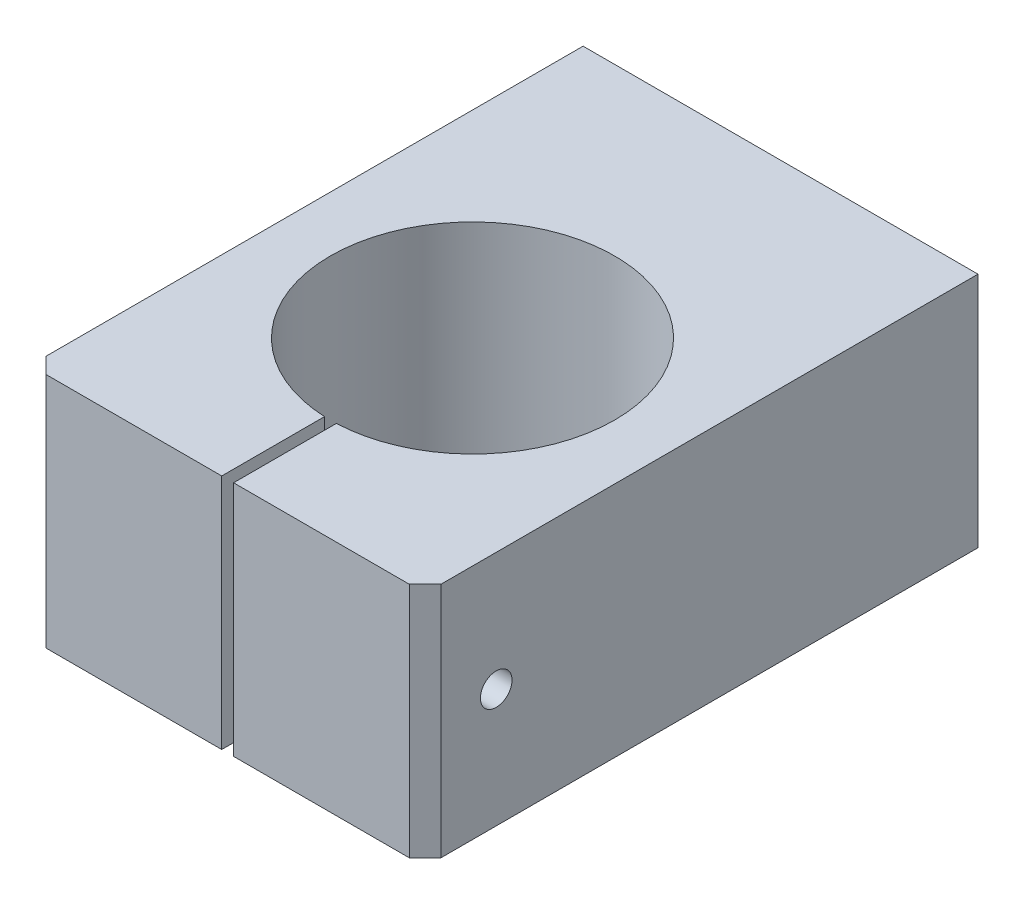
ISO-10303-21;
HEADER;
FILE_DESCRIPTION(('STEP AP214'),'2;1');
FILE_NAME('part.step','',(''),(''),'','','');
FILE_SCHEMA(('AUTOMOTIVE_DESIGN { 1 0 10303 214 1 1 1 1 }'));
ENDSEC;
DATA;
#1=APPLICATION_CONTEXT('core data for automotive mechanical design processes');
#2=APPLICATION_PROTOCOL_DEFINITION('international standard','automotive_design',2000,#1);
#3=PRODUCT_CONTEXT('',#1,'mechanical');
#4=PRODUCT('Part','Part','',(#3));
#5=PRODUCT_RELATED_PRODUCT_CATEGORY('part','',(#4));
#6=PRODUCT_DEFINITION_FORMATION('','',#4);
#7=PRODUCT_DEFINITION_CONTEXT('part definition',#1,'design');
#8=PRODUCT_DEFINITION('design','',#6,#7);
#9=PRODUCT_DEFINITION_SHAPE('','',#8);
#10=(LENGTH_UNIT() NAMED_UNIT(*) SI_UNIT(.MILLI.,.METRE.));
#11=(NAMED_UNIT(*) PLANE_ANGLE_UNIT() SI_UNIT($,.RADIAN.));
#12=(NAMED_UNIT(*) SI_UNIT($,.STERADIAN.) SOLID_ANGLE_UNIT());
#13=UNCERTAINTY_MEASURE_WITH_UNIT(LENGTH_MEASURE(1.E-05),#10,'distance_accuracy_value','');
#14=(GEOMETRIC_REPRESENTATION_CONTEXT(3) GLOBAL_UNCERTAINTY_ASSIGNED_CONTEXT((#13)) GLOBAL_UNIT_ASSIGNED_CONTEXT((#10,
#11,#12)) REPRESENTATION_CONTEXT('',''));
#15=CARTESIAN_POINT('',(0.,0.,0.));
#16=DIRECTION('',(0.,0.,1.));
#17=DIRECTION('',(1.,0.,0.));
#18=AXIS2_PLACEMENT_3D('',#15,#16,#17);
#19=CARTESIAN_POINT('',(-18.,105.,61.));
#20=DIRECTION('',(-1.,0.,0.));
#21=DIRECTION('',(0.,0.,1.));
#22=AXIS2_PLACEMENT_3D('',#19,#20,#21);
#23=PLANE('',#22);
#24=CARTESIAN_POINT('',(-18.,105.,61.));
#25=DIRECTION('',(-1.,0.,0.));
#26=DIRECTION('',(0.,0.,1.));
#27=AXIS2_PLACEMENT_3D('',#24,#25,#26);
#28=CIRCLE('',#27,2.75);
#29=CARTESIAN_POINT('',(-18.,105.,63.75));
#30=VERTEX_POINT('',#29);
#31=EDGE_CURVE('E138',#30,#30,#28,.F.);
#32=ORIENTED_EDGE('',*,*,#31,.T.);
#33=EDGE_LOOP('',(#32));
#34=FACE_BOUND('',#33,.T.);
#35=CARTESIAN_POINT('',(-18.,105.,61.));
#36=DIRECTION('',(-1.,0.,0.));
#37=DIRECTION('',(0.,0.,1.));
#38=AXIS2_PLACEMENT_3D('',#35,#36,#37);
#39=CIRCLE('',#38,5.49999999999999);
#40=CARTESIAN_POINT('',(-18.,105.,66.5));
#41=VERTEX_POINT('',#40);
#42=EDGE_CURVE('E21',#41,#41,#39,.T.);
#43=ORIENTED_EDGE('',*,*,#42,.T.);
#44=EDGE_LOOP('',(#43));
#45=FACE_BOUND('',#44,.T.);
#46=ADVANCED_FACE('F18',(#34,#45),#23,.T.);
#47=CARTESIAN_POINT('',(-18.,105.,61.));
#48=DIRECTION('',(-1.,0.,0.));
#49=DIRECTION('',(0.,0.,1.));
#50=AXIS2_PLACEMENT_3D('',#47,#48,#49);
#51=CYLINDRICAL_SURFACE('',#50,5.49999999999999);
#52=ORIENTED_EDGE('',*,*,#42,.F.);
#53=EDGE_LOOP('',(#52));
#54=FACE_BOUND('',#53,.T.);
#55=CARTESIAN_POINT('',(-25.,105.,61.));
#56=DIRECTION('',(-1.,0.,0.));
#57=DIRECTION('',(0.,0.,1.));
#58=AXIS2_PLACEMENT_3D('',#55,#56,#57);
#59=CIRCLE('',#58,5.49999999999999);
#60=CARTESIAN_POINT('',(-25.,105.,66.5));
#61=VERTEX_POINT('',#60);
#62=EDGE_CURVE('E157',#61,#61,#59,.T.);
#63=ORIENTED_EDGE('',*,*,#62,.T.);
#64=EDGE_LOOP('',(#63));
#65=FACE_BOUND('',#64,.T.);
#66=ADVANCED_FACE('F201',(#54,#65),#51,.F.);
#67=CARTESIAN_POINT('',(7.02817459305202,105.,61.));
#68=DIRECTION('',(-1.,0.,0.));
#69=DIRECTION('',(0.,0.,1.));
#70=AXIS2_PLACEMENT_3D('',#67,#68,#69);
#71=CYLINDRICAL_SURFACE('',#70,2.75);
#72=ORIENTED_EDGE('',*,*,#31,.F.);
#73=EDGE_LOOP('',(#72));
#74=FACE_BOUND('',#73,.T.);
#75=CARTESIAN_POINT('',(-0.750000000000002,105.,61.));
#76=DIRECTION('',(-1.,0.,0.));
#77=DIRECTION('',(0.,0.,1.));
#78=AXIS2_PLACEMENT_3D('',#75,#76,#77);
#79=CIRCLE('',#78,2.75);
#80=CARTESIAN_POINT('',(-0.750000000000002,105.,63.75));
#81=VERTEX_POINT('',#80);
#82=EDGE_CURVE('E98',#81,#81,#79,.F.);
#83=ORIENTED_EDGE('',*,*,#82,.T.);
#84=EDGE_LOOP('',(#83));
#85=FACE_BOUND('',#84,.T.);
#86=ADVANCED_FACE('F204',(#74,#85),#71,.F.);
#87=CARTESIAN_POINT('',(30.6568542494923,105.,61.));
#88=DIRECTION('',(-1.,0.,0.));
#89=DIRECTION('',(0.,0.,1.));
#90=AXIS2_PLACEMENT_3D('',#87,#88,#89);
#91=CYLINDRICAL_SURFACE('',#90,1.99999999999999);
#92=CARTESIAN_POINT('',(0.749999999999997,105.,61.));
#93=DIRECTION('',(-1.,0.,0.));
#94=DIRECTION('',(0.,0.,1.));
#95=AXIS2_PLACEMENT_3D('',#92,#93,#94);
#96=CIRCLE('',#95,1.99999999999999);
#97=CARTESIAN_POINT('',(0.749999999999997,105.,63.));
#98=VERTEX_POINT('',#97);
#99=EDGE_CURVE('E86',#98,#98,#96,.T.);
#100=ORIENTED_EDGE('',*,*,#99,.T.);
#101=EDGE_LOOP('',(#100));
#102=FACE_BOUND('',#101,.T.);
#103=CARTESIAN_POINT('',(25.,105.,61.));
#104=DIRECTION('',(-1.,0.,0.));
#105=DIRECTION('',(0.,0.,1.));
#106=AXIS2_PLACEMENT_3D('',#103,#104,#105);
#107=CIRCLE('',#106,1.99999999999999);
#108=CARTESIAN_POINT('',(25.,105.,63.));
#109=VERTEX_POINT('',#108);
#110=EDGE_CURVE('E137',#109,#109,#107,.F.);
#111=ORIENTED_EDGE('',*,*,#110,.T.);
#112=EDGE_LOOP('',(#111));
#113=FACE_BOUND('',#112,.T.);
#114=ADVANCED_FACE('F304',(#102,#113),#91,.F.);
#115=CARTESIAN_POINT('',(-25.,120.,70.));
#116=DIRECTION('',(0.,0.,1.));
#117=DIRECTION('',(1.,0.,0.));
#118=AXIS2_PLACEMENT_3D('',#115,#116,#117);
#119=PLANE('',#118);
#120=DIRECTION('',(1.,0.,0.));
#121=VECTOR('',#120,1.);
#122=CARTESIAN_POINT('',(25.,120.,70.));
#123=LINE('',#122,#121);
#124=CARTESIAN_POINT('',(23.,120.,70.));
#125=VERTEX_POINT('',#124);
#126=CARTESIAN_POINT('',(0.750000000000001,120.,70.));
#127=VERTEX_POINT('',#126);
#128=EDGE_CURVE('E62',#125,#127,#123,.F.);
#129=ORIENTED_EDGE('',*,*,#128,.T.);
#130=DIRECTION('',(0.,1.,0.));
#131=VECTOR('',#130,1.);
#132=CARTESIAN_POINT('',(0.750000000000001,29.1970395457589,70.));
#133=LINE('',#132,#131);
#134=CARTESIAN_POINT('',(0.749999999999998,90.,70.));
#135=VERTEX_POINT('',#134);
#136=EDGE_CURVE('E85',#127,#135,#133,.F.);
#137=ORIENTED_EDGE('',*,*,#136,.T.);
#138=DIRECTION('',(1.,0.,0.));
#139=VECTOR('',#138,1.);
#140=CARTESIAN_POINT('',(-25.,90.,70.));
#141=LINE('',#140,#139);
#142=CARTESIAN_POINT('',(23.,90.,70.));
#143=VERTEX_POINT('',#142);
#144=EDGE_CURVE('E107',#135,#143,#141,.T.);
#145=ORIENTED_EDGE('',*,*,#144,.T.);
#146=DIRECTION('',(0.,1.,0.));
#147=VECTOR('',#146,1.);
#148=CARTESIAN_POINT('',(23.,120.,70.));
#149=LINE('',#148,#147);
#150=EDGE_CURVE('E134',#125,#143,#149,.F.);
#151=ORIENTED_EDGE('',*,*,#150,.F.);
#152=EDGE_LOOP('',(#129,#137,#145,#151));
#153=FACE_BOUND('',#152,.T.);
#154=ADVANCED_FACE('F300',(#153),#119,.T.);
#155=CARTESIAN_POINT('',(23.,120.,70.));
#156=DIRECTION('',(0.70710678118655,0.,0.707106781186545));
#157=DIRECTION('',(0.707106781186545,0.,-0.70710678118655));
#158=AXIS2_PLACEMENT_3D('',#155,#156,#157);
#159=PLANE('',#158);
#160=DIRECTION('',(-0.707106781186545,0.,0.70710678118655));
#161=VECTOR('',#160,1.);
#162=CARTESIAN_POINT('',(25.,120.,68.));
#163=LINE('',#162,#161);
#164=CARTESIAN_POINT('',(25.,120.,68.));
#165=VERTEX_POINT('',#164);
#166=EDGE_CURVE('E123',#165,#125,#163,.T.);
#167=ORIENTED_EDGE('',*,*,#166,.T.);
#168=ORIENTED_EDGE('',*,*,#150,.T.);
#169=DIRECTION('',(0.707106781186547,0.,-0.707106781186547));
#170=VECTOR('',#169,1.);
#171=CARTESIAN_POINT('',(23.,90.,70.));
#172=LINE('',#171,#170);
#173=CARTESIAN_POINT('',(25.,90.,68.));
#174=VERTEX_POINT('',#173);
#175=EDGE_CURVE('E110',#143,#174,#172,.T.);
#176=ORIENTED_EDGE('',*,*,#175,.T.);
#177=DIRECTION('',(0.,1.,0.));
#178=VECTOR('',#177,1.);
#179=CARTESIAN_POINT('',(25.,120.,68.));
#180=LINE('',#179,#178);
#181=EDGE_CURVE('E145',#174,#165,#180,.T.);
#182=ORIENTED_EDGE('',*,*,#181,.T.);
#183=EDGE_LOOP('',(#167,#168,#176,#182));
#184=FACE_BOUND('',#183,.T.);
#185=ADVANCED_FACE('F297',(#184),#159,.T.);
#186=CARTESIAN_POINT('',(25.,120.,70.));
#187=DIRECTION('',(-1.,0.,0.));
#188=DIRECTION('',(0.,0.,1.));
#189=AXIS2_PLACEMENT_3D('',#186,#187,#188);
#190=PLANE('',#189);
#191=ORIENTED_EDGE('',*,*,#181,.F.);
#192=DIRECTION('',(0.,0.,1.));
#193=VECTOR('',#192,1.);
#194=CARTESIAN_POINT('',(25.,90.,70.));
#195=LINE('',#194,#193);
#196=CARTESIAN_POINT('',(25.,90.,0.));
#197=VERTEX_POINT('',#196);
#198=EDGE_CURVE('E176',#174,#197,#195,.F.);
#199=ORIENTED_EDGE('',*,*,#198,.T.);
#200=DIRECTION('',(0.,1.,0.));
#201=VECTOR('',#200,1.);
#202=CARTESIAN_POINT('',(25.,120.,0.));
#203=LINE('',#202,#201);
#204=CARTESIAN_POINT('',(25.,120.,0.));
#205=VERTEX_POINT('',#204);
#206=EDGE_CURVE('E148',#197,#205,#203,.T.);
#207=ORIENTED_EDGE('',*,*,#206,.T.);
#208=DIRECTION('',(0.,0.,-1.));
#209=VECTOR('',#208,1.);
#210=CARTESIAN_POINT('',(25.,120.,70.));
#211=LINE('',#210,#209);
#212=EDGE_CURVE('E131',#205,#165,#211,.F.);
#213=ORIENTED_EDGE('',*,*,#212,.T.);
#214=EDGE_LOOP('',(#191,#199,#207,#213));
#215=FACE_BOUND('',#214,.T.);
#216=ORIENTED_EDGE('',*,*,#110,.F.);
#217=EDGE_LOOP('',(#216));
#218=FACE_BOUND('',#217,.T.);
#219=ADVANCED_FACE('F221',(#215,#218),#190,.F.);
#220=CARTESIAN_POINT('',(-25.,120.,0.));
#221=DIRECTION('',(0.,0.,1.));
#222=DIRECTION('',(1.,0.,0.));
#223=AXIS2_PLACEMENT_3D('',#220,#221,#222);
#224=PLANE('',#223);
#225=DIRECTION('',(1.,0.,0.));
#226=VECTOR('',#225,1.);
#227=CARTESIAN_POINT('',(25.,120.,0.));
#228=LINE('',#227,#226);
#229=CARTESIAN_POINT('',(-25.,120.,0.));
#230=VERTEX_POINT('',#229);
#231=EDGE_CURVE('E116',#230,#205,#228,.T.);
#232=ORIENTED_EDGE('',*,*,#231,.T.);
#233=ORIENTED_EDGE('',*,*,#206,.F.);
#234=DIRECTION('',(1.,0.,0.));
#235=VECTOR('',#234,1.);
#236=CARTESIAN_POINT('',(-25.,90.,0.));
#237=LINE('',#236,#235);
#238=CARTESIAN_POINT('',(-25.,90.,0.));
#239=VERTEX_POINT('',#238);
#240=EDGE_CURVE('E171',#197,#239,#237,.F.);
#241=ORIENTED_EDGE('',*,*,#240,.T.);
#242=DIRECTION('',(0.,1.,0.));
#243=VECTOR('',#242,1.);
#244=CARTESIAN_POINT('',(-25.,90.,0.));
#245=LINE('',#244,#243);
#246=EDGE_CURVE('E102',#239,#230,#245,.T.);
#247=ORIENTED_EDGE('',*,*,#246,.T.);
#248=EDGE_LOOP('',(#232,#233,#241,#247));
#249=FACE_BOUND('',#248,.T.);
#250=ADVANCED_FACE('F210',(#249),#224,.F.);
#251=CARTESIAN_POINT('',(-25.,90.,70.));
#252=DIRECTION('',(1.,0.,0.));
#253=DIRECTION('',(0.,0.,-1.));
#254=AXIS2_PLACEMENT_3D('',#251,#252,#253);
#255=PLANE('',#254);
#256=DIRECTION('',(0.,1.,0.));
#257=VECTOR('',#256,1.);
#258=CARTESIAN_POINT('',(-25.,120.,68.));
#259=LINE('',#258,#257);
#260=CARTESIAN_POINT('',(-25.,120.,68.));
#261=VERTEX_POINT('',#260);
#262=CARTESIAN_POINT('',(-25.,90.,68.));
#263=VERTEX_POINT('',#262);
#264=EDGE_CURVE('E99',#261,#263,#259,.F.);
#265=ORIENTED_EDGE('',*,*,#264,.F.);
#266=DIRECTION('',(0.,0.,-1.));
#267=VECTOR('',#266,1.);
#268=CARTESIAN_POINT('',(-25.,120.,70.));
#269=LINE('',#268,#267);
#270=EDGE_CURVE('E91',#261,#230,#269,.T.);
#271=ORIENTED_EDGE('',*,*,#270,.T.);
#272=ORIENTED_EDGE('',*,*,#246,.F.);
#273=DIRECTION('',(0.,0.,1.));
#274=VECTOR('',#273,1.);
#275=CARTESIAN_POINT('',(-25.,90.,70.));
#276=LINE('',#275,#274);
#277=EDGE_CURVE('E168',#239,#263,#276,.T.);
#278=ORIENTED_EDGE('',*,*,#277,.T.);
#279=EDGE_LOOP('',(#265,#271,#272,#278));
#280=FACE_BOUND('',#279,.T.);
#281=ORIENTED_EDGE('',*,*,#62,.F.);
#282=EDGE_LOOP('',(#281));
#283=FACE_BOUND('',#282,.T.);
#284=ADVANCED_FACE('F207',(#280,#283),#255,.F.);
#285=CARTESIAN_POINT('',(-23.,120.,70.));
#286=DIRECTION('',(-0.70710678118655,0.,0.707106781186545));
#287=DIRECTION('',(0.707106781186545,0.,0.70710678118655));
#288=AXIS2_PLACEMENT_3D('',#285,#286,#287);
#289=PLANE('',#288);
#290=DIRECTION('',(0.707106781186545,0.,0.70710678118655));
#291=VECTOR('',#290,1.);
#292=CARTESIAN_POINT('',(-25.,90.,68.));
#293=LINE('',#292,#291);
#294=CARTESIAN_POINT('',(-23.,90.,70.));
#295=VERTEX_POINT('',#294);
#296=EDGE_CURVE('E78',#263,#295,#293,.T.);
#297=ORIENTED_EDGE('',*,*,#296,.T.);
#298=DIRECTION('',(0.,1.,0.));
#299=VECTOR('',#298,1.);
#300=CARTESIAN_POINT('',(-23.,120.,70.));
#301=LINE('',#300,#299);
#302=CARTESIAN_POINT('',(-23.,120.,70.));
#303=VERTEX_POINT('',#302);
#304=EDGE_CURVE('E95',#303,#295,#301,.F.);
#305=ORIENTED_EDGE('',*,*,#304,.F.);
#306=DIRECTION('',(-0.707106781186547,0.,-0.707106781186547));
#307=VECTOR('',#306,1.);
#308=CARTESIAN_POINT('',(-23.,120.,70.));
#309=LINE('',#308,#307);
#310=EDGE_CURVE('E89',#303,#261,#309,.T.);
#311=ORIENTED_EDGE('',*,*,#310,.T.);
#312=ORIENTED_EDGE('',*,*,#264,.T.);
#313=EDGE_LOOP('',(#297,#305,#311,#312));
#314=FACE_BOUND('',#313,.T.);
#315=ADVANCED_FACE('F209',(#314),#289,.T.);
#316=CARTESIAN_POINT('',(-25.,120.,70.));
#317=DIRECTION('',(0.,0.,1.));
#318=DIRECTION('',(1.,0.,0.));
#319=AXIS2_PLACEMENT_3D('',#316,#317,#318);
#320=PLANE('',#319);
#321=DIRECTION('',(1.,0.,0.));
#322=VECTOR('',#321,1.);
#323=CARTESIAN_POINT('',(-25.,90.,70.));
#324=LINE('',#323,#322);
#325=CARTESIAN_POINT('',(-0.750000000000001,90.,70.));
#326=VERTEX_POINT('',#325);
#327=EDGE_CURVE('E75',#295,#326,#324,.T.);
#328=ORIENTED_EDGE('',*,*,#327,.T.);
#329=DIRECTION('',(0.,1.,0.));
#330=VECTOR('',#329,1.);
#331=CARTESIAN_POINT('',(-0.750000000000001,29.1970395457589,70.));
#332=LINE('',#331,#330);
#333=CARTESIAN_POINT('',(-0.750000000000001,120.,70.));
#334=VERTEX_POINT('',#333);
#335=EDGE_CURVE('E113',#326,#334,#332,.T.);
#336=ORIENTED_EDGE('',*,*,#335,.T.);
#337=DIRECTION('',(1.,0.,0.));
#338=VECTOR('',#337,1.);
#339=CARTESIAN_POINT('',(25.,120.,70.));
#340=LINE('',#339,#338);
#341=EDGE_CURVE('E58',#334,#303,#340,.F.);
#342=ORIENTED_EDGE('',*,*,#341,.T.);
#343=ORIENTED_EDGE('',*,*,#304,.T.);
#344=EDGE_LOOP('',(#328,#336,#342,#343));
#345=FACE_BOUND('',#344,.T.);
#346=ADVANCED_FACE('F218',(#345),#320,.T.);
#347=CARTESIAN_POINT('',(-0.750000000000001,29.1970395457589,56.9843682124227));
#348=DIRECTION('',(-1.,0.,0.));
#349=DIRECTION('',(0.,0.,1.));
#350=AXIS2_PLACEMENT_3D('',#347,#348,#349);
#351=PLANE('',#350);
#352=DIRECTION('',(0.,1.,0.));
#353=VECTOR('',#352,1.);
#354=CARTESIAN_POINT('',(-0.750000000000007,29.1970395457589,56.9843682124227));
#355=LINE('',#354,#353);
#356=CARTESIAN_POINT('',(-0.750000000000004,90.,56.9843682124227));
#357=VERTEX_POINT('',#356);
#358=CARTESIAN_POINT('',(-0.750000000000004,120.,56.9843682124227));
#359=VERTEX_POINT('',#358);
#360=EDGE_CURVE('E67',#357,#359,#355,.T.);
#361=ORIENTED_EDGE('',*,*,#360,.T.);
#362=DIRECTION('',(0.,0.,-1.));
#363=VECTOR('',#362,1.);
#364=CARTESIAN_POINT('',(-0.750000000000001,120.,70.));
#365=LINE('',#364,#363);
#366=EDGE_CURVE('E50',#359,#334,#365,.F.);
#367=ORIENTED_EDGE('',*,*,#366,.T.);
#368=ORIENTED_EDGE('',*,*,#335,.F.);
#369=DIRECTION('',(0.,0.,1.));
#370=VECTOR('',#369,1.);
#371=CARTESIAN_POINT('',(-0.750000000000001,90.,70.));
#372=LINE('',#371,#370);
#373=EDGE_CURVE('E74',#326,#357,#372,.F.);
#374=ORIENTED_EDGE('',*,*,#373,.T.);
#375=EDGE_LOOP('',(#361,#367,#368,#374));
#376=FACE_BOUND('',#375,.T.);
#377=ORIENTED_EDGE('',*,*,#82,.F.);
#378=EDGE_LOOP('',(#377));
#379=FACE_BOUND('',#378,.T.);
#380=ADVANCED_FACE('F71',(#376,#379),#351,.F.);
#381=CARTESIAN_POINT('',(25.,120.,70.));
#382=DIRECTION('',(0.,-1.,0.));
#383=DIRECTION('',(0.,0.,-1.));
#384=AXIS2_PLACEMENT_3D('',#381,#382,#383);
#385=PLANE('',#384);
#386=ORIENTED_EDGE('',*,*,#310,.F.);
#387=ORIENTED_EDGE('',*,*,#341,.F.);
#388=ORIENTED_EDGE('',*,*,#366,.F.);
#389=CARTESIAN_POINT('',(0.,120.,39.));
#390=DIRECTION('',(0.,1.,0.));
#391=DIRECTION('',(0.,0.,1.));
#392=AXIS2_PLACEMENT_3D('',#389,#390,#391);
#393=CIRCLE('',#392,18.);
#394=CARTESIAN_POINT('',(0.749999999999998,120.,56.9843682124227));
#395=VERTEX_POINT('',#394);
#396=EDGE_CURVE('E55',#359,#395,#393,.F.);
#397=ORIENTED_EDGE('',*,*,#396,.T.);
#398=DIRECTION('',(0.,0.,-1.));
#399=VECTOR('',#398,1.);
#400=CARTESIAN_POINT('',(0.749999999999998,120.,56.9843682124227));
#401=LINE('',#400,#399);
#402=EDGE_CURVE('E83',#395,#127,#401,.F.);
#403=ORIENTED_EDGE('',*,*,#402,.T.);
#404=ORIENTED_EDGE('',*,*,#128,.F.);
#405=ORIENTED_EDGE('',*,*,#166,.F.);
#406=ORIENTED_EDGE('',*,*,#212,.F.);
#407=ORIENTED_EDGE('',*,*,#231,.F.);
#408=ORIENTED_EDGE('',*,*,#270,.F.);
#409=EDGE_LOOP('',(#386,#387,#388,#397,#403,#404,#405,#406,#407,#408));
#410=FACE_BOUND('',#409,.T.);
#411=ADVANCED_FACE('F53',(#410),#385,.F.);
#412=CARTESIAN_POINT('',(0.749999999999998,29.1970395457589,56.9843682124227));
#413=DIRECTION('',(1.,0.,0.));
#414=DIRECTION('',(0.,0.,-1.));
#415=AXIS2_PLACEMENT_3D('',#412,#413,#414);
#416=PLANE('',#415);
#417=ORIENTED_EDGE('',*,*,#136,.F.);
#418=ORIENTED_EDGE('',*,*,#402,.F.);
#419=DIRECTION('',(0.,1.,0.));
#420=VECTOR('',#419,1.);
#421=CARTESIAN_POINT('',(0.749999999999998,29.1970395457589,56.9843682124227));
#422=LINE('',#421,#420);
#423=CARTESIAN_POINT('',(0.749999999999998,90.,56.9843682124227));
#424=VERTEX_POINT('',#423);
#425=EDGE_CURVE('E27',#395,#424,#422,.F.);
#426=ORIENTED_EDGE('',*,*,#425,.T.);
#427=DIRECTION('',(0.,0.,1.));
#428=VECTOR('',#427,1.);
#429=CARTESIAN_POINT('',(0.749999999999997,90.,70.));
#430=LINE('',#429,#428);
#431=EDGE_CURVE('E34',#424,#135,#430,.T.);
#432=ORIENTED_EDGE('',*,*,#431,.T.);
#433=EDGE_LOOP('',(#417,#418,#426,#432));
#434=FACE_BOUND('',#433,.T.);
#435=ORIENTED_EDGE('',*,*,#99,.F.);
#436=EDGE_LOOP('',(#435));
#437=FACE_BOUND('',#436,.T.);
#438=ADVANCED_FACE('F231',(#434,#437),#416,.F.);
#439=CARTESIAN_POINT('',(-25.,90.,70.));
#440=DIRECTION('',(0.,1.,0.));
#441=DIRECTION('',(0.,0.,1.));
#442=AXIS2_PLACEMENT_3D('',#439,#440,#441);
#443=PLANE('',#442);
#444=ORIENTED_EDGE('',*,*,#296,.F.);
#445=ORIENTED_EDGE('',*,*,#277,.F.);
#446=ORIENTED_EDGE('',*,*,#240,.F.);
#447=ORIENTED_EDGE('',*,*,#198,.F.);
#448=ORIENTED_EDGE('',*,*,#175,.F.);
#449=ORIENTED_EDGE('',*,*,#144,.F.);
#450=ORIENTED_EDGE('',*,*,#431,.F.);
#451=CARTESIAN_POINT('',(0.,90.,39.));
#452=DIRECTION('',(0.,1.,0.));
#453=DIRECTION('',(0.,0.,1.));
#454=AXIS2_PLACEMENT_3D('',#451,#452,#453);
#455=CIRCLE('',#454,18.);
#456=EDGE_CURVE('E11',#424,#357,#455,.T.);
#457=ORIENTED_EDGE('',*,*,#456,.T.);
#458=ORIENTED_EDGE('',*,*,#373,.F.);
#459=ORIENTED_EDGE('',*,*,#327,.F.);
#460=EDGE_LOOP('',(#444,#445,#446,#447,#448,#449,#450,#457,#458,#459));
#461=FACE_BOUND('',#460,.T.);
#462=ADVANCED_FACE('F226',(#461),#443,.F.);
#463=CARTESIAN_POINT('',(0.,29.1970395457589,39.));
#464=DIRECTION('',(0.,1.,0.));
#465=DIRECTION('',(0.,0.,1.));
#466=AXIS2_PLACEMENT_3D('',#463,#464,#465);
#467=CYLINDRICAL_SURFACE('',#466,18.);
#468=ORIENTED_EDGE('',*,*,#425,.F.);
#469=ORIENTED_EDGE('',*,*,#396,.F.);
#470=ORIENTED_EDGE('',*,*,#360,.F.);
#471=ORIENTED_EDGE('',*,*,#456,.F.);
#472=EDGE_LOOP('',(#468,#469,#470,#471));
#473=FACE_BOUND('',#472,.T.);
#474=ADVANCED_FACE('F66',(#473),#467,.F.);
#475=CLOSED_SHELL('',(#46,#66,#86,#114,#154,#185,#219,#250,#284,#315,#346,#380,#411,#438,#462,#474));
#476=MANIFOLD_SOLID_BREP('B1',#475);
#477=ADVANCED_BREP_SHAPE_REPRESENTATION('',(#18,#476),#14);
#478=SHAPE_DEFINITION_REPRESENTATION(#9,#477);
ENDSEC;
END-ISO-10303-21;
